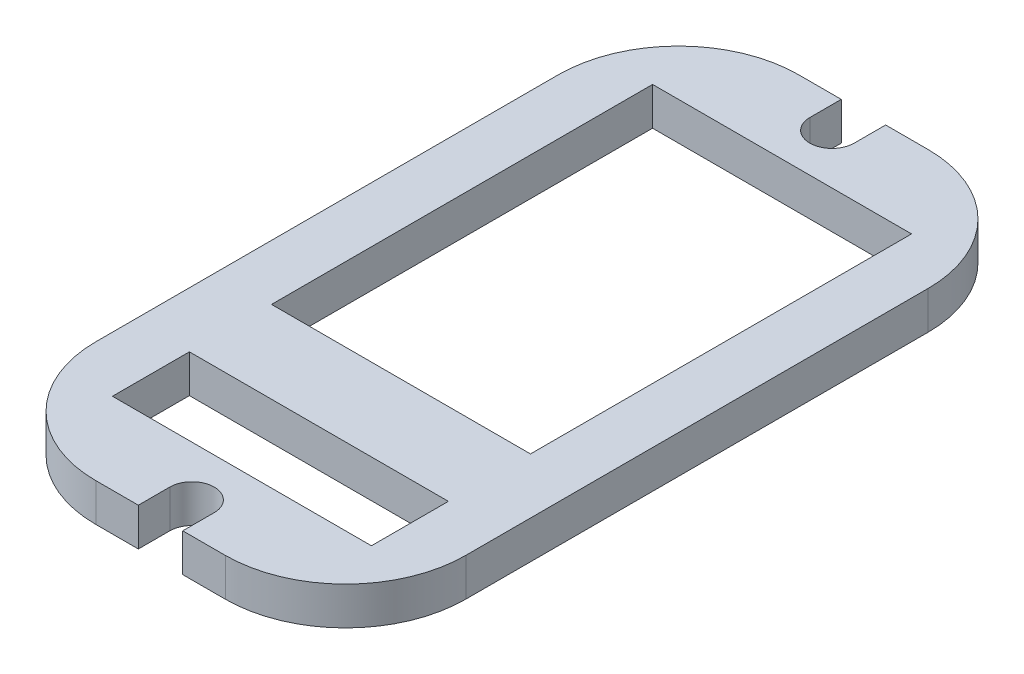
ISO-10303-21;
HEADER;
FILE_DESCRIPTION(('STEP AP214'),'2;1');
FILE_NAME('part.step','',(''),(''),'','','');
FILE_SCHEMA(('AUTOMOTIVE_DESIGN { 1 0 10303 214 1 1 1 1 }'));
ENDSEC;
DATA;
#1=APPLICATION_CONTEXT('core data for automotive mechanical design processes');
#2=APPLICATION_PROTOCOL_DEFINITION('international standard','automotive_design',2000,#1);
#3=PRODUCT_CONTEXT('',#1,'mechanical');
#4=PRODUCT('Part','Part','',(#3));
#5=PRODUCT_RELATED_PRODUCT_CATEGORY('part','',(#4));
#6=PRODUCT_DEFINITION_FORMATION('','',#4);
#7=PRODUCT_DEFINITION_CONTEXT('part definition',#1,'design');
#8=PRODUCT_DEFINITION('design','',#6,#7);
#9=PRODUCT_DEFINITION_SHAPE('','',#8);
#10=(LENGTH_UNIT() NAMED_UNIT(*) SI_UNIT(.MILLI.,.METRE.));
#11=(NAMED_UNIT(*) PLANE_ANGLE_UNIT() SI_UNIT($,.RADIAN.));
#12=(NAMED_UNIT(*) SI_UNIT($,.STERADIAN.) SOLID_ANGLE_UNIT());
#13=UNCERTAINTY_MEASURE_WITH_UNIT(LENGTH_MEASURE(1.E-05),#10,'distance_accuracy_value','');
#14=(GEOMETRIC_REPRESENTATION_CONTEXT(3) GLOBAL_UNCERTAINTY_ASSIGNED_CONTEXT((#13)) GLOBAL_UNIT_ASSIGNED_CONTEXT((#10,
#11,#12)) REPRESENTATION_CONTEXT('',''));
#15=CARTESIAN_POINT('',(0.,0.,0.));
#16=DIRECTION('',(0.,0.,1.));
#17=DIRECTION('',(1.,0.,0.));
#18=AXIS2_PLACEMENT_3D('',#15,#16,#17);
#19=CARTESIAN_POINT('',(0.,1.026,-8.65));
#20=DIRECTION('',(0.,1.,0.));
#21=DIRECTION('',(0.,0.,1.));
#22=AXIS2_PLACEMENT_3D('',#19,#20,#21);
#23=PLANE('',#22);
#24=CARTESIAN_POINT('',(0.,1.026,-8.65));
#25=DIRECTION('',(0.,-1.,0.));
#26=DIRECTION('',(0.,0.,1.));
#27=AXIS2_PLACEMENT_3D('',#24,#25,#26);
#28=CIRCLE('',#27,0.599999999999999);
#29=CARTESIAN_POINT('',(0.599999999999996,1.026,-8.65));
#30=VERTEX_POINT('',#29);
#31=CARTESIAN_POINT('',(-0.600000000000002,1.026,-8.65));
#32=VERTEX_POINT('',#31);
#33=EDGE_CURVE('E261',#30,#32,#28,.T.);
#34=ORIENTED_EDGE('',*,*,#33,.T.);
#35=DIRECTION('',(0.,0.,-1.));
#36=VECTOR('',#35,1.);
#37=CARTESIAN_POINT('',(-0.600000000000005,1.026,-9.5));
#38=LINE('',#37,#36);
#39=CARTESIAN_POINT('',(-0.600000000000005,1.026,-9.5));
#40=VERTEX_POINT('',#39);
#41=EDGE_CURVE('E264',#32,#40,#38,.T.);
#42=ORIENTED_EDGE('',*,*,#41,.T.);
#43=DIRECTION('',(-1.,0.,0.));
#44=VECTOR('',#43,1.);
#45=CARTESIAN_POINT('',(-0.600000000000005,1.026,-9.5));
#46=LINE('',#45,#44);
#47=CARTESIAN_POINT('',(-1.75000000000001,1.026,-9.5));
#48=VERTEX_POINT('',#47);
#49=EDGE_CURVE('E267',#40,#48,#46,.T.);
#50=ORIENTED_EDGE('',*,*,#49,.T.);
#51=CARTESIAN_POINT('',(-1.75000000000001,1.026,-6.25));
#52=DIRECTION('',(0.,1.,0.));
#53=DIRECTION('',(0.,0.,1.));
#54=AXIS2_PLACEMENT_3D('',#51,#52,#53);
#55=CIRCLE('',#54,3.25);
#56=CARTESIAN_POINT('',(-5.,1.026,-6.25));
#57=VERTEX_POINT('',#56);
#58=EDGE_CURVE('E269',#48,#57,#55,.T.);
#59=ORIENTED_EDGE('',*,*,#58,.T.);
#60=DIRECTION('',(0.,0.,1.));
#61=VECTOR('',#60,1.);
#62=CARTESIAN_POINT('',(-5.,1.026,-6.25));
#63=LINE('',#62,#61);
#64=CARTESIAN_POINT('',(-5.,1.026,6.25000000000001));
#65=VERTEX_POINT('',#64);
#66=EDGE_CURVE('E271',#57,#65,#63,.T.);
#67=ORIENTED_EDGE('',*,*,#66,.T.);
#68=CARTESIAN_POINT('',(-1.75000000000001,1.026,6.25000000000001));
#69=DIRECTION('',(0.,1.,0.));
#70=DIRECTION('',(0.,0.,1.));
#71=AXIS2_PLACEMENT_3D('',#68,#69,#70);
#72=CIRCLE('',#71,3.24999999999999);
#73=CARTESIAN_POINT('',(-1.75,1.026,9.5));
#74=VERTEX_POINT('',#73);
#75=EDGE_CURVE('E273',#65,#74,#72,.T.);
#76=ORIENTED_EDGE('',*,*,#75,.T.);
#77=DIRECTION('',(1.,0.,0.));
#78=VECTOR('',#77,1.);
#79=CARTESIAN_POINT('',(-1.75000000000001,1.026,9.5));
#80=LINE('',#79,#78);
#81=CARTESIAN_POINT('',(-0.600000000000005,1.026,9.5));
#82=VERTEX_POINT('',#81);
#83=EDGE_CURVE('E275',#74,#82,#80,.T.);
#84=ORIENTED_EDGE('',*,*,#83,.T.);
#85=DIRECTION('',(0.,0.,-1.));
#86=VECTOR('',#85,1.);
#87=CARTESIAN_POINT('',(-0.599999999999991,1.026,8.65));
#88=LINE('',#87,#86);
#89=CARTESIAN_POINT('',(-0.599999999999991,1.026,8.65));
#90=VERTEX_POINT('',#89);
#91=EDGE_CURVE('E277',#82,#90,#88,.T.);
#92=ORIENTED_EDGE('',*,*,#91,.T.);
#93=CARTESIAN_POINT('',(0.,1.026,8.65));
#94=DIRECTION('',(0.,-1.,0.));
#95=DIRECTION('',(0.,0.,1.));
#96=AXIS2_PLACEMENT_3D('',#93,#94,#95);
#97=CIRCLE('',#96,0.599999999999996);
#98=CARTESIAN_POINT('',(0.599999999999998,1.026,8.65));
#99=VERTEX_POINT('',#98);
#100=EDGE_CURVE('E279',#90,#99,#97,.T.);
#101=ORIENTED_EDGE('',*,*,#100,.T.);
#102=DIRECTION('',(0.,0.,1.));
#103=VECTOR('',#102,1.);
#104=CARTESIAN_POINT('',(0.600000000000001,1.026,8.65));
#105=LINE('',#104,#103);
#106=CARTESIAN_POINT('',(0.599999999999993,1.026,9.5));
#107=VERTEX_POINT('',#106);
#108=EDGE_CURVE('E281',#99,#107,#105,.T.);
#109=ORIENTED_EDGE('',*,*,#108,.T.);
#110=DIRECTION('',(1.,0.,0.));
#111=VECTOR('',#110,1.);
#112=CARTESIAN_POINT('',(0.599999999999993,1.026,9.5));
#113=LINE('',#112,#111);
#114=CARTESIAN_POINT('',(1.75,1.026,9.5));
#115=VERTEX_POINT('',#114);
#116=EDGE_CURVE('E283',#107,#115,#113,.T.);
#117=ORIENTED_EDGE('',*,*,#116,.T.);
#118=CARTESIAN_POINT('',(1.75000000000001,1.026,6.25));
#119=DIRECTION('',(0.,1.,0.));
#120=DIRECTION('',(0.,0.,1.));
#121=AXIS2_PLACEMENT_3D('',#118,#119,#120);
#122=CIRCLE('',#121,3.25);
#123=CARTESIAN_POINT('',(5.,1.026,6.25000000000001));
#124=VERTEX_POINT('',#123);
#125=EDGE_CURVE('E285',#115,#124,#122,.T.);
#126=ORIENTED_EDGE('',*,*,#125,.T.);
#127=DIRECTION('',(0.,0.,-1.));
#128=VECTOR('',#127,1.);
#129=CARTESIAN_POINT('',(5.,1.026,6.25000000000001));
#130=LINE('',#129,#128);
#131=CARTESIAN_POINT('',(5.,1.026,-6.25));
#132=VERTEX_POINT('',#131);
#133=EDGE_CURVE('E287',#124,#132,#130,.T.);
#134=ORIENTED_EDGE('',*,*,#133,.T.);
#135=CARTESIAN_POINT('',(1.75,1.026,-6.25));
#136=DIRECTION('',(0.,1.,0.));
#137=DIRECTION('',(0.,0.,1.));
#138=AXIS2_PLACEMENT_3D('',#135,#136,#137);
#139=CIRCLE('',#138,3.25);
#140=CARTESIAN_POINT('',(1.75,1.026,-9.5));
#141=VERTEX_POINT('',#140);
#142=EDGE_CURVE('E289',#132,#141,#139,.T.);
#143=ORIENTED_EDGE('',*,*,#142,.T.);
#144=DIRECTION('',(-1.,0.,0.));
#145=VECTOR('',#144,1.);
#146=CARTESIAN_POINT('',(1.75,1.026,-9.5));
#147=LINE('',#146,#145);
#148=CARTESIAN_POINT('',(0.599999999999993,1.026,-9.5));
#149=VERTEX_POINT('',#148);
#150=EDGE_CURVE('E291',#141,#149,#147,.T.);
#151=ORIENTED_EDGE('',*,*,#150,.T.);
#152=DIRECTION('',(0.,0.,1.));
#153=VECTOR('',#152,1.);
#154=CARTESIAN_POINT('',(0.599999999999993,1.026,-9.5));
#155=LINE('',#154,#153);
#156=EDGE_CURVE('E293',#149,#30,#155,.T.);
#157=ORIENTED_EDGE('',*,*,#156,.T.);
#158=EDGE_LOOP('',(#34,#42,#50,#59,#67,#76,#84,#92,#101,#109,#117,#126,#134,#143,#151,#157));
#159=FACE_BOUND('',#158,.T.);
#160=DIRECTION('',(1.,0.,0.));
#161=VECTOR('',#160,1.);
#162=CARTESIAN_POINT('',(-3.5,1.026,3.));
#163=LINE('',#162,#161);
#164=CARTESIAN_POINT('',(-3.5,1.026,3.));
#165=VERTEX_POINT('',#164);
#166=CARTESIAN_POINT('',(3.5,1.026,3.));
#167=VERTEX_POINT('',#166);
#168=EDGE_CURVE('E232',#165,#167,#163,.T.);
#169=ORIENTED_EDGE('',*,*,#168,.F.);
#170=DIRECTION('',(0.,0.,1.));
#171=VECTOR('',#170,1.);
#172=CARTESIAN_POINT('',(-3.5,1.026,-7.3));
#173=LINE('',#172,#171);
#174=CARTESIAN_POINT('',(-3.5,1.026,-7.3));
#175=VERTEX_POINT('',#174);
#176=EDGE_CURVE('E230',#175,#165,#173,.T.);
#177=ORIENTED_EDGE('',*,*,#176,.F.);
#178=DIRECTION('',(-1.,0.,0.));
#179=VECTOR('',#178,1.);
#180=CARTESIAN_POINT('',(3.5,1.026,-7.3));
#181=LINE('',#180,#179);
#182=CARTESIAN_POINT('',(3.5,1.026,-7.3));
#183=VERTEX_POINT('',#182);
#184=EDGE_CURVE('E238',#183,#175,#181,.T.);
#185=ORIENTED_EDGE('',*,*,#184,.F.);
#186=DIRECTION('',(0.,0.,-1.));
#187=VECTOR('',#186,1.);
#188=CARTESIAN_POINT('',(3.5,1.026,3.));
#189=LINE('',#188,#187);
#190=EDGE_CURVE('E235',#167,#183,#189,.T.);
#191=ORIENTED_EDGE('',*,*,#190,.F.);
#192=EDGE_LOOP('',(#169,#177,#185,#191));
#193=FACE_BOUND('',#192,.T.);
#194=DIRECTION('',(1.,0.,0.));
#195=VECTOR('',#194,1.);
#196=CARTESIAN_POINT('',(-3.5,1.026,7.3));
#197=LINE('',#196,#195);
#198=CARTESIAN_POINT('',(-3.5,1.026,7.3));
#199=VERTEX_POINT('',#198);
#200=CARTESIAN_POINT('',(3.5,1.026,7.3));
#201=VERTEX_POINT('',#200);
#202=EDGE_CURVE('E202',#199,#201,#197,.T.);
#203=ORIENTED_EDGE('',*,*,#202,.F.);
#204=DIRECTION('',(0.,0.,1.));
#205=VECTOR('',#204,1.);
#206=CARTESIAN_POINT('',(-3.5,1.026,5.22));
#207=LINE('',#206,#205);
#208=CARTESIAN_POINT('',(-3.5,1.026,5.22));
#209=VERTEX_POINT('',#208);
#210=EDGE_CURVE('E194',#209,#199,#207,.T.);
#211=ORIENTED_EDGE('',*,*,#210,.F.);
#212=DIRECTION('',(-1.,0.,0.));
#213=VECTOR('',#212,1.);
#214=CARTESIAN_POINT('',(3.5,1.026,5.22));
#215=LINE('',#214,#213);
#216=CARTESIAN_POINT('',(3.5,1.026,5.22));
#217=VERTEX_POINT('',#216);
#218=EDGE_CURVE('E216',#217,#209,#215,.T.);
#219=ORIENTED_EDGE('',*,*,#218,.F.);
#220=DIRECTION('',(0.,0.,-1.));
#221=VECTOR('',#220,1.);
#222=CARTESIAN_POINT('',(3.5,1.026,7.3));
#223=LINE('',#222,#221);
#224=EDGE_CURVE('E214',#201,#217,#223,.T.);
#225=ORIENTED_EDGE('',*,*,#224,.F.);
#226=EDGE_LOOP('',(#203,#211,#219,#225));
#227=FACE_BOUND('',#226,.T.);
#228=ADVANCED_FACE('F33',(#159,#193,#227),#23,.T.);
#229=CARTESIAN_POINT('',(0.,0.,-8.65));
#230=DIRECTION('',(0.,1.,0.));
#231=DIRECTION('',(0.,0.,1.));
#232=AXIS2_PLACEMENT_3D('',#229,#230,#231);
#233=PLANE('',#232);
#234=DIRECTION('',(0.,0.,1.));
#235=VECTOR('',#234,1.);
#236=CARTESIAN_POINT('',(-3.5,0.,-7.3));
#237=LINE('',#236,#235);
#238=CARTESIAN_POINT('',(-3.5,0.,-7.3));
#239=VERTEX_POINT('',#238);
#240=CARTESIAN_POINT('',(-3.5,0.,3.));
#241=VERTEX_POINT('',#240);
#242=EDGE_CURVE('E210',#239,#241,#237,.T.);
#243=ORIENTED_EDGE('',*,*,#242,.T.);
#244=DIRECTION('',(1.,0.,0.));
#245=VECTOR('',#244,1.);
#246=CARTESIAN_POINT('',(-3.5,0.,3.));
#247=LINE('',#246,#245);
#248=CARTESIAN_POINT('',(3.5,0.,3.));
#249=VERTEX_POINT('',#248);
#250=EDGE_CURVE('E243',#241,#249,#247,.T.);
#251=ORIENTED_EDGE('',*,*,#250,.T.);
#252=DIRECTION('',(0.,0.,-1.));
#253=VECTOR('',#252,1.);
#254=CARTESIAN_POINT('',(3.5,0.,3.));
#255=LINE('',#254,#253);
#256=CARTESIAN_POINT('',(3.5,0.,-7.3));
#257=VERTEX_POINT('',#256);
#258=EDGE_CURVE('E246',#249,#257,#255,.T.);
#259=ORIENTED_EDGE('',*,*,#258,.T.);
#260=DIRECTION('',(-1.,0.,0.));
#261=VECTOR('',#260,1.);
#262=CARTESIAN_POINT('',(3.5,0.,-7.3));
#263=LINE('',#262,#261);
#264=EDGE_CURVE('E233',#257,#239,#263,.T.);
#265=ORIENTED_EDGE('',*,*,#264,.T.);
#266=EDGE_LOOP('',(#243,#251,#259,#265));
#267=FACE_BOUND('',#266,.T.);
#268=CARTESIAN_POINT('',(0.,0.,-8.65));
#269=DIRECTION('',(0.,-1.,0.));
#270=DIRECTION('',(0.,0.,1.));
#271=AXIS2_PLACEMENT_3D('',#268,#269,#270);
#272=CIRCLE('',#271,0.599999999999999);
#273=CARTESIAN_POINT('',(0.599999999999996,0.,-8.65));
#274=VERTEX_POINT('',#273);
#275=CARTESIAN_POINT('',(-0.600000000000002,0.,-8.65));
#276=VERTEX_POINT('',#275);
#277=EDGE_CURVE('E260',#274,#276,#272,.T.);
#278=ORIENTED_EDGE('',*,*,#277,.F.);
#279=DIRECTION('',(0.,0.,1.));
#280=VECTOR('',#279,1.);
#281=CARTESIAN_POINT('',(0.599999999999993,0.,-9.5));
#282=LINE('',#281,#280);
#283=CARTESIAN_POINT('',(0.599999999999993,0.,-9.5));
#284=VERTEX_POINT('',#283);
#285=EDGE_CURVE('E265',#284,#274,#282,.T.);
#286=ORIENTED_EDGE('',*,*,#285,.F.);
#287=DIRECTION('',(-1.,0.,0.));
#288=VECTOR('',#287,1.);
#289=CARTESIAN_POINT('',(1.75,0.,-9.5));
#290=LINE('',#289,#288);
#291=CARTESIAN_POINT('',(1.75,0.,-9.5));
#292=VERTEX_POINT('',#291);
#293=EDGE_CURVE('E324',#292,#284,#290,.T.);
#294=ORIENTED_EDGE('',*,*,#293,.F.);
#295=CARTESIAN_POINT('',(1.75,0.,-6.25));
#296=DIRECTION('',(0.,1.,0.));
#297=DIRECTION('',(0.,0.,1.));
#298=AXIS2_PLACEMENT_3D('',#295,#296,#297);
#299=CIRCLE('',#298,3.25);
#300=CARTESIAN_POINT('',(5.,0.,-6.25));
#301=VERTEX_POINT('',#300);
#302=EDGE_CURVE('E322',#301,#292,#299,.T.);
#303=ORIENTED_EDGE('',*,*,#302,.F.);
#304=DIRECTION('',(0.,0.,-1.));
#305=VECTOR('',#304,1.);
#306=CARTESIAN_POINT('',(5.,0.,6.25000000000001));
#307=LINE('',#306,#305);
#308=CARTESIAN_POINT('',(5.,0.,6.25000000000001));
#309=VERTEX_POINT('',#308);
#310=EDGE_CURVE('E320',#309,#301,#307,.T.);
#311=ORIENTED_EDGE('',*,*,#310,.F.);
#312=CARTESIAN_POINT('',(1.75000000000001,0.,6.25));
#313=DIRECTION('',(0.,1.,0.));
#314=DIRECTION('',(0.,0.,1.));
#315=AXIS2_PLACEMENT_3D('',#312,#313,#314);
#316=CIRCLE('',#315,3.25);
#317=CARTESIAN_POINT('',(1.75,0.,9.5));
#318=VERTEX_POINT('',#317);
#319=EDGE_CURVE('E318',#318,#309,#316,.T.);
#320=ORIENTED_EDGE('',*,*,#319,.F.);
#321=DIRECTION('',(1.,0.,0.));
#322=VECTOR('',#321,1.);
#323=CARTESIAN_POINT('',(0.599999999999993,0.,9.5));
#324=LINE('',#323,#322);
#325=CARTESIAN_POINT('',(0.599999999999993,0.,9.5));
#326=VERTEX_POINT('',#325);
#327=EDGE_CURVE('E316',#326,#318,#324,.T.);
#328=ORIENTED_EDGE('',*,*,#327,.F.);
#329=DIRECTION('',(0.,0.,1.));
#330=VECTOR('',#329,1.);
#331=CARTESIAN_POINT('',(0.600000000000001,0.,8.65));
#332=LINE('',#331,#330);
#333=CARTESIAN_POINT('',(0.599999999999998,0.,8.65));
#334=VERTEX_POINT('',#333);
#335=EDGE_CURVE('E314',#334,#326,#332,.T.);
#336=ORIENTED_EDGE('',*,*,#335,.F.);
#337=CARTESIAN_POINT('',(0.,0.,8.65));
#338=DIRECTION('',(0.,-1.,0.));
#339=DIRECTION('',(0.,0.,1.));
#340=AXIS2_PLACEMENT_3D('',#337,#338,#339);
#341=CIRCLE('',#340,0.599999999999996);
#342=CARTESIAN_POINT('',(-0.599999999999991,0.,8.65));
#343=VERTEX_POINT('',#342);
#344=EDGE_CURVE('E312',#343,#334,#341,.T.);
#345=ORIENTED_EDGE('',*,*,#344,.F.);
#346=DIRECTION('',(0.,0.,-1.));
#347=VECTOR('',#346,1.);
#348=CARTESIAN_POINT('',(-0.599999999999991,0.,8.65));
#349=LINE('',#348,#347);
#350=CARTESIAN_POINT('',(-0.600000000000005,0.,9.5));
#351=VERTEX_POINT('',#350);
#352=EDGE_CURVE('E310',#351,#343,#349,.T.);
#353=ORIENTED_EDGE('',*,*,#352,.F.);
#354=DIRECTION('',(1.,0.,0.));
#355=VECTOR('',#354,1.);
#356=CARTESIAN_POINT('',(-1.75000000000001,0.,9.5));
#357=LINE('',#356,#355);
#358=CARTESIAN_POINT('',(-1.75,0.,9.5));
#359=VERTEX_POINT('',#358);
#360=EDGE_CURVE('E308',#359,#351,#357,.T.);
#361=ORIENTED_EDGE('',*,*,#360,.F.);
#362=CARTESIAN_POINT('',(-1.75000000000001,0.,6.25000000000001));
#363=DIRECTION('',(0.,1.,0.));
#364=DIRECTION('',(0.,0.,1.));
#365=AXIS2_PLACEMENT_3D('',#362,#363,#364);
#366=CIRCLE('',#365,3.24999999999999);
#367=CARTESIAN_POINT('',(-5.,0.,6.25000000000001));
#368=VERTEX_POINT('',#367);
#369=EDGE_CURVE('E306',#368,#359,#366,.T.);
#370=ORIENTED_EDGE('',*,*,#369,.F.);
#371=DIRECTION('',(0.,0.,1.));
#372=VECTOR('',#371,1.);
#373=CARTESIAN_POINT('',(-5.,0.,-6.25));
#374=LINE('',#373,#372);
#375=CARTESIAN_POINT('',(-5.,0.,-6.25));
#376=VERTEX_POINT('',#375);
#377=EDGE_CURVE('E304',#376,#368,#374,.T.);
#378=ORIENTED_EDGE('',*,*,#377,.F.);
#379=CARTESIAN_POINT('',(-1.75000000000001,0.,-6.25));
#380=DIRECTION('',(0.,1.,0.));
#381=DIRECTION('',(0.,0.,1.));
#382=AXIS2_PLACEMENT_3D('',#379,#380,#381);
#383=CIRCLE('',#382,3.25);
#384=CARTESIAN_POINT('',(-1.75000000000001,0.,-9.5));
#385=VERTEX_POINT('',#384);
#386=EDGE_CURVE('E302',#385,#376,#383,.T.);
#387=ORIENTED_EDGE('',*,*,#386,.F.);
#388=DIRECTION('',(-1.,0.,0.));
#389=VECTOR('',#388,1.);
#390=CARTESIAN_POINT('',(-0.600000000000005,0.,-9.5));
#391=LINE('',#390,#389);
#392=CARTESIAN_POINT('',(-0.600000000000005,0.,-9.5));
#393=VERTEX_POINT('',#392);
#394=EDGE_CURVE('E300',#393,#385,#391,.T.);
#395=ORIENTED_EDGE('',*,*,#394,.F.);
#396=DIRECTION('',(0.,0.,-1.));
#397=VECTOR('',#396,1.);
#398=CARTESIAN_POINT('',(-0.600000000000005,0.,-9.5));
#399=LINE('',#398,#397);
#400=EDGE_CURVE('E298',#276,#393,#399,.T.);
#401=ORIENTED_EDGE('',*,*,#400,.F.);
#402=EDGE_LOOP('',(#278,#286,#294,#303,#311,#320,#328,#336,#345,#353,#361,#370,#378,#387,#395,#401));
#403=FACE_BOUND('',#402,.T.);
#404=DIRECTION('',(0.,0.,1.));
#405=VECTOR('',#404,1.);
#406=CARTESIAN_POINT('',(-3.5,0.,5.22));
#407=LINE('',#406,#405);
#408=CARTESIAN_POINT('',(-3.5,0.,5.22));
#409=VERTEX_POINT('',#408);
#410=CARTESIAN_POINT('',(-3.5,0.,7.3));
#411=VERTEX_POINT('',#410);
#412=EDGE_CURVE('E56',#409,#411,#407,.T.);
#413=ORIENTED_EDGE('',*,*,#412,.T.);
#414=DIRECTION('',(1.,0.,0.));
#415=VECTOR('',#414,1.);
#416=CARTESIAN_POINT('',(-3.5,0.,7.3));
#417=LINE('',#416,#415);
#418=CARTESIAN_POINT('',(3.5,0.,7.3));
#419=VERTEX_POINT('',#418);
#420=EDGE_CURVE('E209',#411,#419,#417,.T.);
#421=ORIENTED_EDGE('',*,*,#420,.T.);
#422=DIRECTION('',(0.,0.,-1.));
#423=VECTOR('',#422,1.);
#424=CARTESIAN_POINT('',(3.5,0.,7.3));
#425=LINE('',#424,#423);
#426=CARTESIAN_POINT('',(3.5,0.,5.22));
#427=VERTEX_POINT('',#426);
#428=EDGE_CURVE('E222',#419,#427,#425,.T.);
#429=ORIENTED_EDGE('',*,*,#428,.T.);
#430=DIRECTION('',(-1.,0.,0.));
#431=VECTOR('',#430,1.);
#432=CARTESIAN_POINT('',(3.5,0.,5.22));
#433=LINE('',#432,#431);
#434=EDGE_CURVE('E203',#427,#409,#433,.T.);
#435=ORIENTED_EDGE('',*,*,#434,.T.);
#436=EDGE_LOOP('',(#413,#421,#429,#435));
#437=FACE_BOUND('',#436,.T.);
#438=ADVANCED_FACE('F378',(#267,#403,#437),#233,.F.);
#439=CARTESIAN_POINT('',(0.,1.026,-8.65));
#440=DIRECTION('',(0.,-1.,0.));
#441=DIRECTION('',(0.,0.,-1.));
#442=AXIS2_PLACEMENT_3D('',#439,#440,#441);
#443=CYLINDRICAL_SURFACE('',#442,0.599999999999999);
#444=ORIENTED_EDGE('',*,*,#277,.T.);
#445=DIRECTION('',(0.,-1.,0.));
#446=VECTOR('',#445,1.);
#447=CARTESIAN_POINT('',(-0.600000000000002,1.026,-8.65));
#448=LINE('',#447,#446);
#449=EDGE_CURVE('E11',#32,#276,#448,.T.);
#450=ORIENTED_EDGE('',*,*,#449,.F.);
#451=ORIENTED_EDGE('',*,*,#33,.F.);
#452=DIRECTION('',(0.,-1.,0.));
#453=VECTOR('',#452,1.);
#454=CARTESIAN_POINT('',(0.599999999999996,1.026,-8.65));
#455=LINE('',#454,#453);
#456=EDGE_CURVE('E295',#30,#274,#455,.T.);
#457=ORIENTED_EDGE('',*,*,#456,.T.);
#458=EDGE_LOOP('',(#444,#450,#451,#457));
#459=FACE_BOUND('',#458,.T.);
#460=ADVANCED_FACE('F35',(#459),#443,.F.);
#461=CARTESIAN_POINT('',(-0.600000000000005,1.026,-9.5));
#462=DIRECTION('',(-1.,0.,0.));
#463=DIRECTION('',(0.,0.,1.));
#464=AXIS2_PLACEMENT_3D('',#461,#462,#463);
#465=PLANE('',#464);
#466=ORIENTED_EDGE('',*,*,#400,.T.);
#467=DIRECTION('',(0.,-1.,0.));
#468=VECTOR('',#467,1.);
#469=CARTESIAN_POINT('',(-0.600000000000005,1.026,-9.5));
#470=LINE('',#469,#468);
#471=EDGE_CURVE('E41',#40,#393,#470,.T.);
#472=ORIENTED_EDGE('',*,*,#471,.F.);
#473=ORIENTED_EDGE('',*,*,#41,.F.);
#474=ORIENTED_EDGE('',*,*,#449,.T.);
#475=EDGE_LOOP('',(#466,#472,#473,#474));
#476=FACE_BOUND('',#475,.T.);
#477=ADVANCED_FACE('F396',(#476),#465,.F.);
#478=CARTESIAN_POINT('',(-0.600000000000005,1.026,-9.5));
#479=DIRECTION('',(0.,0.,1.));
#480=DIRECTION('',(1.,0.,0.));
#481=AXIS2_PLACEMENT_3D('',#478,#479,#480);
#482=PLANE('',#481);
#483=ORIENTED_EDGE('',*,*,#394,.T.);
#484=DIRECTION('',(0.,-1.,0.));
#485=VECTOR('',#484,1.);
#486=CARTESIAN_POINT('',(-1.75000000000001,1.026,-9.5));
#487=LINE('',#486,#485);
#488=EDGE_CURVE('E365',#48,#385,#487,.T.);
#489=ORIENTED_EDGE('',*,*,#488,.F.);
#490=ORIENTED_EDGE('',*,*,#49,.F.);
#491=ORIENTED_EDGE('',*,*,#471,.T.);
#492=EDGE_LOOP('',(#483,#489,#490,#491));
#493=FACE_BOUND('',#492,.T.);
#494=ADVANCED_FACE('F372',(#493),#482,.F.);
#495=CARTESIAN_POINT('',(-1.75000000000001,1.026,-6.25));
#496=DIRECTION('',(0.,-1.,0.));
#497=DIRECTION('',(0.,0.,-1.));
#498=AXIS2_PLACEMENT_3D('',#495,#496,#497);
#499=CYLINDRICAL_SURFACE('',#498,3.25);
#500=ORIENTED_EDGE('',*,*,#386,.T.);
#501=DIRECTION('',(0.,-1.,0.));
#502=VECTOR('',#501,1.);
#503=CARTESIAN_POINT('',(-5.,1.026,-6.25));
#504=LINE('',#503,#502);
#505=EDGE_CURVE('E362',#57,#376,#504,.T.);
#506=ORIENTED_EDGE('',*,*,#505,.F.);
#507=ORIENTED_EDGE('',*,*,#58,.F.);
#508=ORIENTED_EDGE('',*,*,#488,.T.);
#509=EDGE_LOOP('',(#500,#506,#507,#508));
#510=FACE_BOUND('',#509,.T.);
#511=ADVANCED_FACE('F384',(#510),#499,.T.);
#512=CARTESIAN_POINT('',(-5.,1.026,-6.25));
#513=DIRECTION('',(1.,0.,0.));
#514=DIRECTION('',(0.,0.,-1.));
#515=AXIS2_PLACEMENT_3D('',#512,#513,#514);
#516=PLANE('',#515);
#517=ORIENTED_EDGE('',*,*,#377,.T.);
#518=DIRECTION('',(0.,-1.,0.));
#519=VECTOR('',#518,1.);
#520=CARTESIAN_POINT('',(-5.,1.026,6.25000000000001));
#521=LINE('',#520,#519);
#522=EDGE_CURVE('E359',#65,#368,#521,.T.);
#523=ORIENTED_EDGE('',*,*,#522,.F.);
#524=ORIENTED_EDGE('',*,*,#66,.F.);
#525=ORIENTED_EDGE('',*,*,#505,.T.);
#526=EDGE_LOOP('',(#517,#523,#524,#525));
#527=FACE_BOUND('',#526,.T.);
#528=ADVANCED_FACE('F388',(#527),#516,.F.);
#529=CARTESIAN_POINT('',(-1.75000000000001,1.026,6.25000000000001));
#530=DIRECTION('',(0.,-1.,0.));
#531=DIRECTION('',(0.,0.,-1.));
#532=AXIS2_PLACEMENT_3D('',#529,#530,#531);
#533=CYLINDRICAL_SURFACE('',#532,3.24999999999999);
#534=ORIENTED_EDGE('',*,*,#369,.T.);
#535=DIRECTION('',(0.,-1.,0.));
#536=VECTOR('',#535,1.);
#537=CARTESIAN_POINT('',(-1.75,1.026,9.5));
#538=LINE('',#537,#536);
#539=EDGE_CURVE('E356',#74,#359,#538,.T.);
#540=ORIENTED_EDGE('',*,*,#539,.F.);
#541=ORIENTED_EDGE('',*,*,#75,.F.);
#542=ORIENTED_EDGE('',*,*,#522,.T.);
#543=EDGE_LOOP('',(#534,#540,#541,#542));
#544=FACE_BOUND('',#543,.T.);
#545=ADVANCED_FACE('F449',(#544),#533,.T.);
#546=CARTESIAN_POINT('',(-1.75000000000001,1.026,9.5));
#547=DIRECTION('',(0.,0.,-1.));
#548=DIRECTION('',(-1.,0.,0.));
#549=AXIS2_PLACEMENT_3D('',#546,#547,#548);
#550=PLANE('',#549);
#551=ORIENTED_EDGE('',*,*,#360,.T.);
#552=DIRECTION('',(0.,-1.,0.));
#553=VECTOR('',#552,1.);
#554=CARTESIAN_POINT('',(-0.600000000000005,1.026,9.5));
#555=LINE('',#554,#553);
#556=EDGE_CURVE('E353',#82,#351,#555,.T.);
#557=ORIENTED_EDGE('',*,*,#556,.F.);
#558=ORIENTED_EDGE('',*,*,#83,.F.);
#559=ORIENTED_EDGE('',*,*,#539,.T.);
#560=EDGE_LOOP('',(#551,#557,#558,#559));
#561=FACE_BOUND('',#560,.T.);
#562=ADVANCED_FACE('F446',(#561),#550,.F.);
#563=CARTESIAN_POINT('',(-0.599999999999991,1.026,8.65));
#564=DIRECTION('',(-1.,0.,0.));
#565=DIRECTION('',(0.,0.,1.));
#566=AXIS2_PLACEMENT_3D('',#563,#564,#565);
#567=PLANE('',#566);
#568=ORIENTED_EDGE('',*,*,#352,.T.);
#569=DIRECTION('',(0.,-1.,0.));
#570=VECTOR('',#569,1.);
#571=CARTESIAN_POINT('',(-0.599999999999991,1.026,8.65));
#572=LINE('',#571,#570);
#573=EDGE_CURVE('E350',#90,#343,#572,.T.);
#574=ORIENTED_EDGE('',*,*,#573,.F.);
#575=ORIENTED_EDGE('',*,*,#91,.F.);
#576=ORIENTED_EDGE('',*,*,#556,.T.);
#577=EDGE_LOOP('',(#568,#574,#575,#576));
#578=FACE_BOUND('',#577,.T.);
#579=ADVANCED_FACE('F442',(#578),#567,.F.);
#580=CARTESIAN_POINT('',(0.,1.026,8.65));
#581=DIRECTION('',(0.,-1.,0.));
#582=DIRECTION('',(0.,0.,-1.));
#583=AXIS2_PLACEMENT_3D('',#580,#581,#582);
#584=CYLINDRICAL_SURFACE('',#583,0.599999999999996);
#585=ORIENTED_EDGE('',*,*,#344,.T.);
#586=DIRECTION('',(0.,-1.,0.));
#587=VECTOR('',#586,1.);
#588=CARTESIAN_POINT('',(0.599999999999998,1.026,8.65));
#589=LINE('',#588,#587);
#590=EDGE_CURVE('E347',#99,#334,#589,.T.);
#591=ORIENTED_EDGE('',*,*,#590,.F.);
#592=ORIENTED_EDGE('',*,*,#100,.F.);
#593=ORIENTED_EDGE('',*,*,#573,.T.);
#594=EDGE_LOOP('',(#585,#591,#592,#593));
#595=FACE_BOUND('',#594,.T.);
#596=ADVANCED_FACE('F438',(#595),#584,.F.);
#597=CARTESIAN_POINT('',(0.600000000000001,1.026,8.65));
#598=DIRECTION('',(1.,0.,0.));
#599=DIRECTION('',(0.,0.,-1.));
#600=AXIS2_PLACEMENT_3D('',#597,#598,#599);
#601=PLANE('',#600);
#602=ORIENTED_EDGE('',*,*,#335,.T.);
#603=DIRECTION('',(0.,-1.,0.));
#604=VECTOR('',#603,1.);
#605=CARTESIAN_POINT('',(0.599999999999993,1.026,9.5));
#606=LINE('',#605,#604);
#607=EDGE_CURVE('E344',#107,#326,#606,.T.);
#608=ORIENTED_EDGE('',*,*,#607,.F.);
#609=ORIENTED_EDGE('',*,*,#108,.F.);
#610=ORIENTED_EDGE('',*,*,#590,.T.);
#611=EDGE_LOOP('',(#602,#608,#609,#610));
#612=FACE_BOUND('',#611,.T.);
#613=ADVANCED_FACE('F433',(#612),#601,.F.);
#614=CARTESIAN_POINT('',(0.599999999999993,1.026,9.5));
#615=DIRECTION('',(0.,0.,-1.));
#616=DIRECTION('',(-1.,0.,0.));
#617=AXIS2_PLACEMENT_3D('',#614,#615,#616);
#618=PLANE('',#617);
#619=ORIENTED_EDGE('',*,*,#327,.T.);
#620=DIRECTION('',(0.,-1.,0.));
#621=VECTOR('',#620,1.);
#622=CARTESIAN_POINT('',(1.75,1.026,9.5));
#623=LINE('',#622,#621);
#624=EDGE_CURVE('E341',#115,#318,#623,.T.);
#625=ORIENTED_EDGE('',*,*,#624,.F.);
#626=ORIENTED_EDGE('',*,*,#116,.F.);
#627=ORIENTED_EDGE('',*,*,#607,.T.);
#628=EDGE_LOOP('',(#619,#625,#626,#627));
#629=FACE_BOUND('',#628,.T.);
#630=ADVANCED_FACE('F427',(#629),#618,.F.);
#631=CARTESIAN_POINT('',(1.75000000000001,1.026,6.25));
#632=DIRECTION('',(0.,-1.,0.));
#633=DIRECTION('',(0.,0.,-1.));
#634=AXIS2_PLACEMENT_3D('',#631,#632,#633);
#635=CYLINDRICAL_SURFACE('',#634,3.25);
#636=ORIENTED_EDGE('',*,*,#319,.T.);
#637=DIRECTION('',(0.,-1.,0.));
#638=VECTOR('',#637,1.);
#639=CARTESIAN_POINT('',(5.,1.026,6.25000000000001));
#640=LINE('',#639,#638);
#641=EDGE_CURVE('E338',#124,#309,#640,.T.);
#642=ORIENTED_EDGE('',*,*,#641,.F.);
#643=ORIENTED_EDGE('',*,*,#125,.F.);
#644=ORIENTED_EDGE('',*,*,#624,.T.);
#645=EDGE_LOOP('',(#636,#642,#643,#644));
#646=FACE_BOUND('',#645,.T.);
#647=ADVANCED_FACE('F423',(#646),#635,.T.);
#648=CARTESIAN_POINT('',(5.,1.026,6.25000000000001));
#649=DIRECTION('',(-1.,0.,0.));
#650=DIRECTION('',(0.,0.,1.));
#651=AXIS2_PLACEMENT_3D('',#648,#649,#650);
#652=PLANE('',#651);
#653=ORIENTED_EDGE('',*,*,#310,.T.);
#654=DIRECTION('',(0.,-1.,0.));
#655=VECTOR('',#654,1.);
#656=CARTESIAN_POINT('',(5.,1.026,-6.25));
#657=LINE('',#656,#655);
#658=EDGE_CURVE('E335',#132,#301,#657,.T.);
#659=ORIENTED_EDGE('',*,*,#658,.F.);
#660=ORIENTED_EDGE('',*,*,#133,.F.);
#661=ORIENTED_EDGE('',*,*,#641,.T.);
#662=EDGE_LOOP('',(#653,#659,#660,#661));
#663=FACE_BOUND('',#662,.T.);
#664=ADVANCED_FACE('F418',(#663),#652,.F.);
#665=CARTESIAN_POINT('',(1.75,1.026,-6.25));
#666=DIRECTION('',(0.,-1.,0.));
#667=DIRECTION('',(0.,0.,-1.));
#668=AXIS2_PLACEMENT_3D('',#665,#666,#667);
#669=CYLINDRICAL_SURFACE('',#668,3.25);
#670=ORIENTED_EDGE('',*,*,#302,.T.);
#671=DIRECTION('',(0.,-1.,0.));
#672=VECTOR('',#671,1.);
#673=CARTESIAN_POINT('',(1.75,1.026,-9.5));
#674=LINE('',#673,#672);
#675=EDGE_CURVE('E332',#141,#292,#674,.T.);
#676=ORIENTED_EDGE('',*,*,#675,.F.);
#677=ORIENTED_EDGE('',*,*,#142,.F.);
#678=ORIENTED_EDGE('',*,*,#658,.T.);
#679=EDGE_LOOP('',(#670,#676,#677,#678));
#680=FACE_BOUND('',#679,.T.);
#681=ADVANCED_FACE('F412',(#680),#669,.T.);
#682=CARTESIAN_POINT('',(1.75,1.026,-9.5));
#683=DIRECTION('',(0.,0.,1.));
#684=DIRECTION('',(1.,0.,0.));
#685=AXIS2_PLACEMENT_3D('',#682,#683,#684);
#686=PLANE('',#685);
#687=ORIENTED_EDGE('',*,*,#293,.T.);
#688=DIRECTION('',(0.,-1.,0.));
#689=VECTOR('',#688,1.);
#690=CARTESIAN_POINT('',(0.599999999999993,1.026,-9.5));
#691=LINE('',#690,#689);
#692=EDGE_CURVE('E329',#149,#284,#691,.T.);
#693=ORIENTED_EDGE('',*,*,#692,.F.);
#694=ORIENTED_EDGE('',*,*,#150,.F.);
#695=ORIENTED_EDGE('',*,*,#675,.T.);
#696=EDGE_LOOP('',(#687,#693,#694,#695));
#697=FACE_BOUND('',#696,.T.);
#698=ADVANCED_FACE('F408',(#697),#686,.F.);
#699=CARTESIAN_POINT('',(0.599999999999993,1.026,-9.5));
#700=DIRECTION('',(1.,0.,0.));
#701=DIRECTION('',(0.,0.,-1.));
#702=AXIS2_PLACEMENT_3D('',#699,#700,#701);
#703=PLANE('',#702);
#704=ORIENTED_EDGE('',*,*,#285,.T.);
#705=ORIENTED_EDGE('',*,*,#456,.F.);
#706=ORIENTED_EDGE('',*,*,#156,.F.);
#707=ORIENTED_EDGE('',*,*,#692,.T.);
#708=EDGE_LOOP('',(#704,#705,#706,#707));
#709=FACE_BOUND('',#708,.T.);
#710=ADVANCED_FACE('F403',(#709),#703,.F.);
#711=CARTESIAN_POINT('',(-3.5,1.026,-7.3));
#712=DIRECTION('',(1.,0.,0.));
#713=DIRECTION('',(0.,0.,-1.));
#714=AXIS2_PLACEMENT_3D('',#711,#712,#713);
#715=PLANE('',#714);
#716=ORIENTED_EDGE('',*,*,#242,.F.);
#717=DIRECTION('',(0.,-1.,0.));
#718=VECTOR('',#717,1.);
#719=CARTESIAN_POINT('',(-3.5,1.026,-7.3));
#720=LINE('',#719,#718);
#721=EDGE_CURVE('E240',#175,#239,#720,.T.);
#722=ORIENTED_EDGE('',*,*,#721,.F.);
#723=ORIENTED_EDGE('',*,*,#176,.T.);
#724=DIRECTION('',(0.,-1.,0.));
#725=VECTOR('',#724,1.);
#726=CARTESIAN_POINT('',(-3.5,1.026,3.));
#727=LINE('',#726,#725);
#728=EDGE_CURVE('E257',#165,#241,#727,.T.);
#729=ORIENTED_EDGE('',*,*,#728,.T.);
#730=EDGE_LOOP('',(#716,#722,#723,#729));
#731=FACE_BOUND('',#730,.T.);
#732=ADVANCED_FACE('F466',(#731),#715,.T.);
#733=CARTESIAN_POINT('',(-3.5,1.026,3.));
#734=DIRECTION('',(0.,0.,-1.));
#735=DIRECTION('',(-1.,0.,0.));
#736=AXIS2_PLACEMENT_3D('',#733,#734,#735);
#737=PLANE('',#736);
#738=ORIENTED_EDGE('',*,*,#250,.F.);
#739=ORIENTED_EDGE('',*,*,#728,.F.);
#740=ORIENTED_EDGE('',*,*,#168,.T.);
#741=DIRECTION('',(0.,-1.,0.));
#742=VECTOR('',#741,1.);
#743=CARTESIAN_POINT('',(3.5,1.026,3.));
#744=LINE('',#743,#742);
#745=EDGE_CURVE('E255',#167,#249,#744,.T.);
#746=ORIENTED_EDGE('',*,*,#745,.T.);
#747=EDGE_LOOP('',(#738,#739,#740,#746));
#748=FACE_BOUND('',#747,.T.);
#749=ADVANCED_FACE('F528',(#748),#737,.T.);
#750=CARTESIAN_POINT('',(3.5,1.026,3.));
#751=DIRECTION('',(-1.,0.,0.));
#752=DIRECTION('',(0.,0.,1.));
#753=AXIS2_PLACEMENT_3D('',#750,#751,#752);
#754=PLANE('',#753);
#755=ORIENTED_EDGE('',*,*,#258,.F.);
#756=ORIENTED_EDGE('',*,*,#745,.F.);
#757=ORIENTED_EDGE('',*,*,#190,.T.);
#758=DIRECTION('',(0.,-1.,0.));
#759=VECTOR('',#758,1.);
#760=CARTESIAN_POINT('',(3.5,1.026,-7.3));
#761=LINE('',#760,#759);
#762=EDGE_CURVE('E253',#183,#257,#761,.T.);
#763=ORIENTED_EDGE('',*,*,#762,.T.);
#764=EDGE_LOOP('',(#755,#756,#757,#763));
#765=FACE_BOUND('',#764,.T.);
#766=ADVANCED_FACE('F535',(#765),#754,.T.);
#767=CARTESIAN_POINT('',(3.5,1.026,-7.3));
#768=DIRECTION('',(0.,0.,1.));
#769=DIRECTION('',(1.,0.,0.));
#770=AXIS2_PLACEMENT_3D('',#767,#768,#769);
#771=PLANE('',#770);
#772=ORIENTED_EDGE('',*,*,#264,.F.);
#773=ORIENTED_EDGE('',*,*,#762,.F.);
#774=ORIENTED_EDGE('',*,*,#184,.T.);
#775=ORIENTED_EDGE('',*,*,#721,.T.);
#776=EDGE_LOOP('',(#772,#773,#774,#775));
#777=FACE_BOUND('',#776,.T.);
#778=ADVANCED_FACE('F542',(#777),#771,.T.);
#779=CARTESIAN_POINT('',(-3.5,1.026,5.22));
#780=DIRECTION('',(1.,0.,0.));
#781=DIRECTION('',(0.,0.,-1.));
#782=AXIS2_PLACEMENT_3D('',#779,#780,#781);
#783=PLANE('',#782);
#784=ORIENTED_EDGE('',*,*,#412,.F.);
#785=DIRECTION('',(0.,-1.,0.));
#786=VECTOR('',#785,1.);
#787=CARTESIAN_POINT('',(-3.5,1.026,5.22));
#788=LINE('',#787,#786);
#789=EDGE_CURVE('E198',#209,#409,#788,.T.);
#790=ORIENTED_EDGE('',*,*,#789,.F.);
#791=ORIENTED_EDGE('',*,*,#210,.T.);
#792=DIRECTION('',(0.,-1.,0.));
#793=VECTOR('',#792,1.);
#794=CARTESIAN_POINT('',(-3.5,1.026,7.3));
#795=LINE('',#794,#793);
#796=EDGE_CURVE('E197',#199,#411,#795,.T.);
#797=ORIENTED_EDGE('',*,*,#796,.T.);
#798=EDGE_LOOP('',(#784,#790,#791,#797));
#799=FACE_BOUND('',#798,.T.);
#800=ADVANCED_FACE('F196',(#799),#783,.T.);
#801=CARTESIAN_POINT('',(-3.5,1.026,7.3));
#802=DIRECTION('',(0.,0.,-1.));
#803=DIRECTION('',(-1.,0.,0.));
#804=AXIS2_PLACEMENT_3D('',#801,#802,#803);
#805=PLANE('',#804);
#806=ORIENTED_EDGE('',*,*,#420,.F.);
#807=ORIENTED_EDGE('',*,*,#796,.F.);
#808=ORIENTED_EDGE('',*,*,#202,.T.);
#809=DIRECTION('',(0.,-1.,0.));
#810=VECTOR('',#809,1.);
#811=CARTESIAN_POINT('',(3.5,1.026,7.3));
#812=LINE('',#811,#810);
#813=EDGE_CURVE('E211',#201,#419,#812,.T.);
#814=ORIENTED_EDGE('',*,*,#813,.T.);
#815=EDGE_LOOP('',(#806,#807,#808,#814));
#816=FACE_BOUND('',#815,.T.);
#817=ADVANCED_FACE('F206',(#816),#805,.T.);
#818=CARTESIAN_POINT('',(3.5,1.026,7.3));
#819=DIRECTION('',(-1.,0.,0.));
#820=DIRECTION('',(0.,0.,1.));
#821=AXIS2_PLACEMENT_3D('',#818,#819,#820);
#822=PLANE('',#821);
#823=ORIENTED_EDGE('',*,*,#428,.F.);
#824=ORIENTED_EDGE('',*,*,#813,.F.);
#825=ORIENTED_EDGE('',*,*,#224,.T.);
#826=DIRECTION('',(0.,-1.,0.));
#827=VECTOR('',#826,1.);
#828=CARTESIAN_POINT('',(3.5,1.026,5.22));
#829=LINE('',#828,#827);
#830=EDGE_CURVE('E48',#217,#427,#829,.T.);
#831=ORIENTED_EDGE('',*,*,#830,.T.);
#832=EDGE_LOOP('',(#823,#824,#825,#831));
#833=FACE_BOUND('',#832,.T.);
#834=ADVANCED_FACE('F563',(#833),#822,.T.);
#835=CARTESIAN_POINT('',(3.5,1.026,5.22));
#836=DIRECTION('',(0.,0.,1.));
#837=DIRECTION('',(1.,0.,0.));
#838=AXIS2_PLACEMENT_3D('',#835,#836,#837);
#839=PLANE('',#838);
#840=ORIENTED_EDGE('',*,*,#434,.F.);
#841=ORIENTED_EDGE('',*,*,#830,.F.);
#842=ORIENTED_EDGE('',*,*,#218,.T.);
#843=ORIENTED_EDGE('',*,*,#789,.T.);
#844=EDGE_LOOP('',(#840,#841,#842,#843));
#845=FACE_BOUND('',#844,.T.);
#846=ADVANCED_FACE('F570',(#845),#839,.T.);
#847=CLOSED_SHELL('',(#228,#438,#460,#477,#494,#511,#528,#545,#562,#579,#596,#613,#630,#647,
#664,#681,#698,#710,#732,#749,#766,#778,#800,#817,#834,#846));
#848=MANIFOLD_SOLID_BREP('B2',#847);
#849=ADVANCED_BREP_SHAPE_REPRESENTATION('',(#18,#848),#14);
#850=SHAPE_DEFINITION_REPRESENTATION(#9,#849);
ENDSEC;
END-ISO-10303-21;
